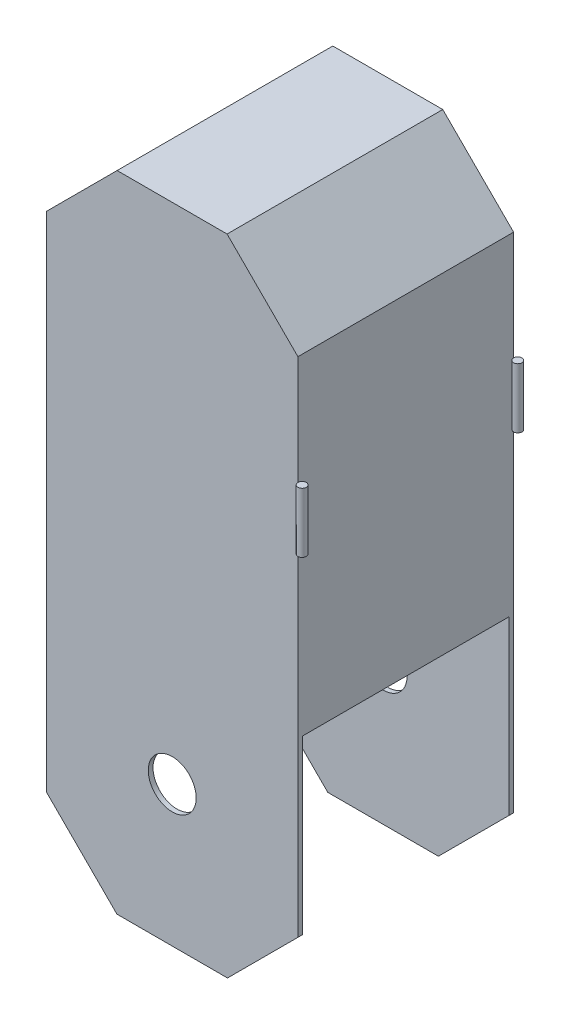
ISO-10303-21;
HEADER;
FILE_DESCRIPTION(('STEP AP214'),'2;1');
FILE_NAME('part.step','',(''),(''),'','','');
FILE_SCHEMA(('AUTOMOTIVE_DESIGN { 1 0 10303 214 1 1 1 1 }'));
ENDSEC;
DATA;
#1=APPLICATION_CONTEXT('core data for automotive mechanical design processes');
#2=APPLICATION_PROTOCOL_DEFINITION('international standard','automotive_design',2000,#1);
#3=PRODUCT_CONTEXT('',#1,'mechanical');
#4=PRODUCT('Part','Part','',(#3));
#5=PRODUCT_RELATED_PRODUCT_CATEGORY('part','',(#4));
#6=PRODUCT_DEFINITION_FORMATION('','',#4);
#7=PRODUCT_DEFINITION_CONTEXT('part definition',#1,'design');
#8=PRODUCT_DEFINITION('design','',#6,#7);
#9=PRODUCT_DEFINITION_SHAPE('','',#8);
#10=(LENGTH_UNIT() NAMED_UNIT(*) SI_UNIT(.MILLI.,.METRE.));
#11=(NAMED_UNIT(*) PLANE_ANGLE_UNIT() SI_UNIT($,.RADIAN.));
#12=(NAMED_UNIT(*) SI_UNIT($,.STERADIAN.) SOLID_ANGLE_UNIT());
#13=UNCERTAINTY_MEASURE_WITH_UNIT(LENGTH_MEASURE(1.E-05),#10,'distance_accuracy_value','');
#14=(GEOMETRIC_REPRESENTATION_CONTEXT(3) GLOBAL_UNCERTAINTY_ASSIGNED_CONTEXT((#13)) GLOBAL_UNIT_ASSIGNED_CONTEXT((#10,
#11,#12)) REPRESENTATION_CONTEXT('',''));
#15=CARTESIAN_POINT('',(0.,0.,0.));
#16=DIRECTION('',(0.,0.,1.));
#17=DIRECTION('',(1.,0.,0.));
#18=AXIS2_PLACEMENT_3D('',#15,#16,#17);
#19=CARTESIAN_POINT('',(108.582921558728,490.825947063665,180.));
#20=DIRECTION('',(0.,-1.,0.));
#21=DIRECTION('',(1.,0.,0.));
#22=AXIS2_PLACEMENT_3D('',#19,#20,#21);
#23=CYLINDRICAL_SURFACE('',#22,3.50000000000001);
#24=CARTESIAN_POINT('',(108.582921558728,490.825947063665,180.));
#25=DIRECTION('',(0.,1.,0.));
#26=DIRECTION('',(1.,0.,0.));
#27=AXIS2_PLACEMENT_3D('',#24,#25,#26);
#28=CIRCLE('',#27,3.50000000000001);
#29=CARTESIAN_POINT('',(112.082921558728,490.825947063665,180.));
#30=VERTEX_POINT('',#29);
#31=EDGE_CURVE('E11',#30,#30,#28,.T.);
#32=ORIENTED_EDGE('',*,*,#31,.F.);
#33=EDGE_LOOP('',(#32));
#34=FACE_BOUND('',#33,.T.);
#35=CARTESIAN_POINT('',(108.582921558728,440.825947063665,180.));
#36=DIRECTION('',(0.,1.,0.));
#37=DIRECTION('',(1.,0.,0.));
#38=AXIS2_PLACEMENT_3D('',#35,#36,#37);
#39=CIRCLE('',#38,3.50000000000001);
#40=CARTESIAN_POINT('',(112.082921558728,440.825947063665,180.));
#41=VERTEX_POINT('',#40);
#42=EDGE_CURVE('E43',#41,#41,#39,.T.);
#43=ORIENTED_EDGE('',*,*,#42,.T.);
#44=EDGE_LOOP('',(#43));
#45=FACE_BOUND('',#44,.T.);
#46=ADVANCED_FACE('F40',(#34,#45),#23,.T.);
#47=CARTESIAN_POINT('',(108.582921558728,490.825947063665,180.));
#48=DIRECTION('',(0.,-1.,0.));
#49=DIRECTION('',(1.,0.,0.));
#50=AXIS2_PLACEMENT_3D('',#47,#48,#49);
#51=PLANE('',#50);
#52=ORIENTED_EDGE('',*,*,#31,.T.);
#53=EDGE_LOOP('',(#52));
#54=FACE_BOUND('',#53,.T.);
#55=ADVANCED_FACE('F55',(#54),#51,.F.);
#56=CARTESIAN_POINT('',(108.582921558728,440.825947063665,180.));
#57=DIRECTION('',(0.,-1.,0.));
#58=DIRECTION('',(1.,0.,0.));
#59=AXIS2_PLACEMENT_3D('',#56,#57,#58);
#60=PLANE('',#59);
#61=ORIENTED_EDGE('',*,*,#42,.F.);
#62=EDGE_LOOP('',(#61));
#63=FACE_BOUND('',#62,.T.);
#64=ADVANCED_FACE('F53',(#63),#60,.T.);
#65=CLOSED_SHELL('',(#46,#55,#64));
#66=MANIFOLD_SOLID_BREP('B2',#65);
#67=CARTESIAN_POINT('',(108.582921558728,490.825947063665,0.));
#68=DIRECTION('',(0.,-1.,0.));
#69=DIRECTION('',(1.,0.,0.));
#70=AXIS2_PLACEMENT_3D('',#67,#68,#69);
#71=CYLINDRICAL_SURFACE('',#70,3.50000000000001);
#72=CARTESIAN_POINT('',(108.582921558728,490.825947063665,0.));
#73=DIRECTION('',(0.,1.,0.));
#74=DIRECTION('',(-1.,0.,0.));
#75=AXIS2_PLACEMENT_3D('',#72,#73,#74);
#76=CIRCLE('',#75,3.50000000000001);
#77=CARTESIAN_POINT('',(105.082921558728,490.825947063665,0.));
#78=VERTEX_POINT('',#77);
#79=EDGE_CURVE('E39',#78,#78,#76,.T.);
#80=ORIENTED_EDGE('',*,*,#79,.F.);
#81=EDGE_LOOP('',(#80));
#82=FACE_BOUND('',#81,.T.);
#83=CARTESIAN_POINT('',(108.582921558728,440.825947063665,0.));
#84=DIRECTION('',(0.,1.,0.));
#85=DIRECTION('',(-1.,0.,0.));
#86=AXIS2_PLACEMENT_3D('',#83,#84,#85);
#87=CIRCLE('',#86,3.50000000000001);
#88=CARTESIAN_POINT('',(105.082921558728,440.825947063665,0.));
#89=VERTEX_POINT('',#88);
#90=EDGE_CURVE('E93',#89,#89,#87,.T.);
#91=ORIENTED_EDGE('',*,*,#90,.T.);
#92=EDGE_LOOP('',(#91));
#93=FACE_BOUND('',#92,.T.);
#94=ADVANCED_FACE('F90',(#82,#93),#71,.T.);
#95=CARTESIAN_POINT('',(108.582921558728,490.825947063665,0.));
#96=DIRECTION('',(0.,1.,0.));
#97=DIRECTION('',(-1.,0.,0.));
#98=AXIS2_PLACEMENT_3D('',#95,#96,#97);
#99=PLANE('',#98);
#100=ORIENTED_EDGE('',*,*,#79,.T.);
#101=EDGE_LOOP('',(#100));
#102=FACE_BOUND('',#101,.T.);
#103=ADVANCED_FACE('F105',(#102),#99,.T.);
#104=CARTESIAN_POINT('',(108.582921558728,440.825947063665,0.));
#105=DIRECTION('',(0.,1.,0.));
#106=DIRECTION('',(-1.,0.,0.));
#107=AXIS2_PLACEMENT_3D('',#104,#105,#106);
#108=PLANE('',#107);
#109=ORIENTED_EDGE('',*,*,#90,.F.);
#110=EDGE_LOOP('',(#109));
#111=FACE_BOUND('',#110,.T.);
#112=ADVANCED_FACE('F103',(#111),#108,.F.);
#113=CLOSED_SHELL('',(#94,#103,#112));
#114=MANIFOLD_SOLID_BREP('B6',#113);
#115=CARTESIAN_POINT('',(-104.917078441272,162.212880509357,180.));
#116=DIRECTION('',(0.707106781186547,0.707106781186547,0.));
#117=DIRECTION('',(-0.707106781186548,0.707106781186548,0.));
#118=AXIS2_PLACEMENT_3D('',#115,#116,#117);
#119=PLANE('',#118);
#120=DIRECTION('',(0.,0.,-1.));
#121=VECTOR('',#120,1.);
#122=CARTESIAN_POINT('',(-104.917078441272,162.212880509357,180.));
#123=LINE('',#122,#121);
#124=CARTESIAN_POINT('',(-104.917078441272,162.212880509357,180.));
#125=VERTEX_POINT('',#124);
#126=CARTESIAN_POINT('',(-104.917078441272,162.212880509357,176.));
#127=VERTEX_POINT('',#126);
#128=EDGE_CURVE('E267',#125,#127,#123,.T.);
#129=ORIENTED_EDGE('',*,*,#128,.T.);
#130=DIRECTION('',(0.707106781186548,-0.707106781186548,0.));
#131=VECTOR('',#130,1.);
#132=CARTESIAN_POINT('',(-104.917078441272,162.212880509357,176.));
#133=LINE('',#132,#131);
#134=CARTESIAN_POINT('',(-45.973174510304,103.268976578389,176.));
#135=VERTEX_POINT('',#134);
#136=EDGE_CURVE('E229',#127,#135,#133,.T.);
#137=ORIENTED_EDGE('',*,*,#136,.T.);
#138=DIRECTION('',(0.,0.,-1.));
#139=VECTOR('',#138,1.);
#140=CARTESIAN_POINT('',(-45.973174510304,103.268976578389,180.));
#141=LINE('',#140,#139);
#142=CARTESIAN_POINT('',(-45.973174510304,103.268976578389,180.));
#143=VERTEX_POINT('',#142);
#144=EDGE_CURVE('E227',#143,#135,#141,.T.);
#145=ORIENTED_EDGE('',*,*,#144,.F.);
#146=DIRECTION('',(0.707106781186547,-0.707106781186547,0.));
#147=VECTOR('',#146,1.);
#148=CARTESIAN_POINT('',(-104.917078441272,162.212880509357,180.));
#149=LINE('',#148,#147);
#150=EDGE_CURVE('E213',#125,#143,#149,.T.);
#151=ORIENTED_EDGE('',*,*,#150,.F.);
#152=EDGE_LOOP('',(#129,#137,#145,#151));
#153=FACE_BOUND('',#152,.T.);
#154=ADVANCED_FACE('F130',(#153),#119,.F.);
#155=CARTESIAN_POINT('',(-45.973174510304,103.268976578389,180.));
#156=DIRECTION('',(0.,1.,0.));
#157=DIRECTION('',(0.,0.,1.));
#158=AXIS2_PLACEMENT_3D('',#155,#156,#157);
#159=PLANE('',#158);
#160=ORIENTED_EDGE('',*,*,#144,.T.);
#161=DIRECTION('',(1.,0.,0.));
#162=VECTOR('',#161,1.);
#163=CARTESIAN_POINT('',(-45.973174510304,103.268976578389,176.));
#164=LINE('',#163,#162);
#165=CARTESIAN_POINT('',(46.326817336749,103.268976578389,176.));
#166=VERTEX_POINT('',#165);
#167=EDGE_CURVE('E322',#135,#166,#164,.T.);
#168=ORIENTED_EDGE('',*,*,#167,.T.);
#169=DIRECTION('',(0.,0.,-1.));
#170=VECTOR('',#169,1.);
#171=CARTESIAN_POINT('',(46.326817336749,103.268976578389,180.));
#172=LINE('',#171,#170);
#173=CARTESIAN_POINT('',(46.326817336749,103.268976578389,180.));
#174=VERTEX_POINT('',#173);
#175=EDGE_CURVE('E237',#174,#166,#172,.T.);
#176=ORIENTED_EDGE('',*,*,#175,.F.);
#177=DIRECTION('',(1.,0.,0.));
#178=VECTOR('',#177,1.);
#179=CARTESIAN_POINT('',(-45.973174510304,103.268976578389,180.));
#180=LINE('',#179,#178);
#181=EDGE_CURVE('E217',#143,#174,#180,.T.);
#182=ORIENTED_EDGE('',*,*,#181,.F.);
#183=EDGE_LOOP('',(#160,#168,#176,#182));
#184=FACE_BOUND('',#183,.T.);
#185=ADVANCED_FACE('F235',(#184),#159,.F.);
#186=CARTESIAN_POINT('',(46.326817336749,103.268976578389,180.));
#187=DIRECTION('',(-0.707106781186547,0.707106781186547,0.));
#188=DIRECTION('',(-0.707106781186548,-0.707106781186548,0.));
#189=AXIS2_PLACEMENT_3D('',#186,#187,#188);
#190=PLANE('',#189);
#191=ORIENTED_EDGE('',*,*,#175,.T.);
#192=DIRECTION('',(0.707106781186548,0.707106781186548,0.));
#193=VECTOR('',#192,1.);
#194=CARTESIAN_POINT('',(46.326817336749,103.268976578389,176.));
#195=LINE('',#194,#193);
#196=CARTESIAN_POINT('',(105.082921558728,162.025080800367,176.));
#197=VERTEX_POINT('',#196);
#198=EDGE_CURVE('E88',#166,#197,#195,.T.);
#199=ORIENTED_EDGE('',*,*,#198,.T.);
#200=DIRECTION('',(0.,0.,-1.));
#201=VECTOR('',#200,1.);
#202=CARTESIAN_POINT('',(105.082921558728,162.025080800368,180.));
#203=LINE('',#202,#201);
#204=CARTESIAN_POINT('',(105.082921558728,162.025080800368,180.));
#205=VERTEX_POINT('',#204);
#206=EDGE_CURVE('E262',#205,#197,#203,.T.);
#207=ORIENTED_EDGE('',*,*,#206,.F.);
#208=DIRECTION('',(0.707106781186547,0.707106781186548,0.));
#209=VECTOR('',#208,1.);
#210=CARTESIAN_POINT('',(46.326817336749,103.268976578389,180.));
#211=LINE('',#210,#209);
#212=EDGE_CURVE('E155',#174,#205,#211,.T.);
#213=ORIENTED_EDGE('',*,*,#212,.F.);
#214=EDGE_LOOP('',(#191,#199,#207,#213));
#215=FACE_BOUND('',#214,.T.);
#216=ADVANCED_FACE('F383',(#215),#190,.F.);
#217=CARTESIAN_POINT('',(105.082921558728,162.025080800368,180.));
#218=DIRECTION('',(-1.,0.,0.));
#219=DIRECTION('',(0.,-1.,0.));
#220=AXIS2_PLACEMENT_3D('',#217,#218,#219);
#221=PLANE('',#220);
#222=ORIENTED_EDGE('',*,*,#206,.T.);
#223=DIRECTION('',(0.,-1.,0.));
#224=VECTOR('',#223,1.);
#225=CARTESIAN_POINT('',(105.082921558728,96.7638285879703,176.));
#226=LINE('',#225,#224);
#227=CARTESIAN_POINT('',(105.082921558728,305.626166773163,176.));
#228=VERTEX_POINT('',#227);
#229=EDGE_CURVE('E341',#228,#197,#226,.T.);
#230=ORIENTED_EDGE('',*,*,#229,.F.);
#231=DIRECTION('',(0.,0.,1.));
#232=VECTOR('',#231,1.);
#233=CARTESIAN_POINT('',(105.082921558728,305.626166773163,176.));
#234=LINE('',#233,#232);
#235=CARTESIAN_POINT('',(105.082921558728,305.626166773163,4.));
#236=VERTEX_POINT('',#235);
#237=EDGE_CURVE('E335',#236,#228,#234,.T.);
#238=ORIENTED_EDGE('',*,*,#237,.F.);
#239=DIRECTION('',(0.,1.,0.));
#240=VECTOR('',#239,1.);
#241=CARTESIAN_POINT('',(105.082921558728,96.7638285879703,4.));
#242=LINE('',#241,#240);
#243=CARTESIAN_POINT('',(105.082921558728,162.025080800367,4.));
#244=VERTEX_POINT('',#243);
#245=EDGE_CURVE('E339',#244,#236,#242,.T.);
#246=ORIENTED_EDGE('',*,*,#245,.F.);
#247=CARTESIAN_POINT('',(105.082921558728,162.025080800368,0.));
#248=VERTEX_POINT('',#247);
#249=EDGE_CURVE('E189',#244,#248,#203,.T.);
#250=ORIENTED_EDGE('',*,*,#249,.T.);
#251=DIRECTION('',(0.,1.,0.));
#252=VECTOR('',#251,1.);
#253=CARTESIAN_POINT('',(105.082921558728,162.025080800368,0.));
#254=LINE('',#253,#252);
#255=CARTESIAN_POINT('',(105.082921558728,581.722068253563,0.));
#256=VERTEX_POINT('',#255);
#257=EDGE_CURVE('E242',#248,#256,#254,.T.);
#258=ORIENTED_EDGE('',*,*,#257,.T.);
#259=DIRECTION('',(0.,0.,-1.));
#260=VECTOR('',#259,1.);
#261=CARTESIAN_POINT('',(105.082921558728,581.722068253563,180.));
#262=LINE('',#261,#260);
#263=CARTESIAN_POINT('',(105.082921558728,581.722068253563,180.));
#264=VERTEX_POINT('',#263);
#265=EDGE_CURVE('E278',#264,#256,#262,.T.);
#266=ORIENTED_EDGE('',*,*,#265,.F.);
#267=DIRECTION('',(0.,1.,0.));
#268=VECTOR('',#267,1.);
#269=CARTESIAN_POINT('',(105.082921558728,162.025080800368,180.));
#270=LINE('',#269,#268);
#271=EDGE_CURVE('E261',#205,#264,#270,.T.);
#272=ORIENTED_EDGE('',*,*,#271,.F.);
#273=EDGE_LOOP('',(#222,#230,#238,#246,#250,#258,#266,#272));
#274=FACE_BOUND('',#273,.T.);
#275=ADVANCED_FACE('F132',(#274),#221,.F.);
#276=CARTESIAN_POINT('',(105.082921558728,581.722068253563,180.));
#277=DIRECTION('',(-0.707106781186548,-0.707106781186547,0.));
#278=DIRECTION('',(0.707106781186547,-0.707106781186548,0.));
#279=AXIS2_PLACEMENT_3D('',#276,#277,#278);
#280=PLANE('',#279);
#281=DIRECTION('',(-0.707106781186547,0.707106781186548,0.));
#282=VECTOR('',#281,1.);
#283=CARTESIAN_POINT('',(105.082921558728,581.722068253563,0.));
#284=LINE('',#283,#282);
#285=CARTESIAN_POINT('',(45.9790427486258,640.825947063665,0.));
#286=VERTEX_POINT('',#285);
#287=EDGE_CURVE('E244',#256,#286,#284,.T.);
#288=ORIENTED_EDGE('',*,*,#287,.T.);
#289=DIRECTION('',(0.,0.,-1.));
#290=VECTOR('',#289,1.);
#291=CARTESIAN_POINT('',(45.9790427486258,640.825947063665,180.));
#292=LINE('',#291,#290);
#293=CARTESIAN_POINT('',(45.9790427486258,640.825947063665,180.));
#294=VERTEX_POINT('',#293);
#295=EDGE_CURVE('E275',#294,#286,#292,.T.);
#296=ORIENTED_EDGE('',*,*,#295,.F.);
#297=DIRECTION('',(-0.707106781186547,0.707106781186548,0.));
#298=VECTOR('',#297,1.);
#299=CARTESIAN_POINT('',(105.082921558728,581.722068253563,180.));
#300=LINE('',#299,#298);
#301=EDGE_CURVE('E198',#264,#294,#300,.T.);
#302=ORIENTED_EDGE('',*,*,#301,.F.);
#303=ORIENTED_EDGE('',*,*,#265,.T.);
#304=EDGE_LOOP('',(#288,#296,#302,#303));
#305=FACE_BOUND('',#304,.T.);
#306=ADVANCED_FACE('F298',(#305),#280,.F.);
#307=CARTESIAN_POINT('',(45.9790427486258,640.825947063665,180.));
#308=DIRECTION('',(0.,-1.,0.));
#309=DIRECTION('',(1.,0.,0.));
#310=AXIS2_PLACEMENT_3D('',#307,#308,#309);
#311=PLANE('',#310);
#312=DIRECTION('',(-1.,0.,0.));
#313=VECTOR('',#312,1.);
#314=CARTESIAN_POINT('',(45.9790427486258,640.825947063665,0.));
#315=LINE('',#314,#313);
#316=CARTESIAN_POINT('',(-45.8131996311706,640.825947063664,0.));
#317=VERTEX_POINT('',#316);
#318=EDGE_CURVE('E246',#286,#317,#315,.T.);
#319=ORIENTED_EDGE('',*,*,#318,.T.);
#320=DIRECTION('',(0.,0.,-1.));
#321=VECTOR('',#320,1.);
#322=CARTESIAN_POINT('',(-45.8131996311706,640.825947063664,180.));
#323=LINE('',#322,#321);
#324=CARTESIAN_POINT('',(-45.8131996311706,640.825947063664,180.));
#325=VERTEX_POINT('',#324);
#326=EDGE_CURVE('E272',#325,#317,#323,.T.);
#327=ORIENTED_EDGE('',*,*,#326,.F.);
#328=DIRECTION('',(-1.,0.,0.));
#329=VECTOR('',#328,1.);
#330=CARTESIAN_POINT('',(45.9790427486258,640.825947063665,180.));
#331=LINE('',#330,#329);
#332=EDGE_CURVE('E303',#294,#325,#331,.T.);
#333=ORIENTED_EDGE('',*,*,#332,.F.);
#334=ORIENTED_EDGE('',*,*,#295,.T.);
#335=EDGE_LOOP('',(#319,#327,#333,#334));
#336=FACE_BOUND('',#335,.T.);
#337=ADVANCED_FACE('F301',(#336),#311,.F.);
#338=CARTESIAN_POINT('',(-45.8131996311706,640.825947063664,180.));
#339=DIRECTION('',(0.707106781186548,-0.707106781186547,0.));
#340=DIRECTION('',(0.707106781186547,0.707106781186548,0.));
#341=AXIS2_PLACEMENT_3D('',#338,#339,#340);
#342=PLANE('',#341);
#343=DIRECTION('',(-0.707106781186547,-0.707106781186548,0.));
#344=VECTOR('',#343,1.);
#345=CARTESIAN_POINT('',(-45.8131996311706,640.825947063664,0.));
#346=LINE('',#345,#344);
#347=CARTESIAN_POINT('',(-104.917078441272,581.722068253563,0.));
#348=VERTEX_POINT('',#347);
#349=EDGE_CURVE('E248',#317,#348,#346,.T.);
#350=ORIENTED_EDGE('',*,*,#349,.T.);
#351=DIRECTION('',(0.,0.,-1.));
#352=VECTOR('',#351,1.);
#353=CARTESIAN_POINT('',(-104.917078441272,581.722068253563,180.));
#354=LINE('',#353,#352);
#355=CARTESIAN_POINT('',(-104.917078441272,581.722068253563,180.));
#356=VERTEX_POINT('',#355);
#357=EDGE_CURVE('E269',#356,#348,#354,.T.);
#358=ORIENTED_EDGE('',*,*,#357,.F.);
#359=DIRECTION('',(-0.707106781186547,-0.707106781186548,0.));
#360=VECTOR('',#359,1.);
#361=CARTESIAN_POINT('',(-45.8131996311706,640.825947063664,180.));
#362=LINE('',#361,#360);
#363=EDGE_CURVE('E315',#325,#356,#362,.T.);
#364=ORIENTED_EDGE('',*,*,#363,.F.);
#365=ORIENTED_EDGE('',*,*,#326,.T.);
#366=EDGE_LOOP('',(#350,#358,#364,#365));
#367=FACE_BOUND('',#366,.T.);
#368=ADVANCED_FACE('F308',(#367),#342,.F.);
#369=CARTESIAN_POINT('',(-104.917078441272,581.722068253563,180.));
#370=DIRECTION('',(1.,0.,0.));
#371=DIRECTION('',(0.,1.,0.));
#372=AXIS2_PLACEMENT_3D('',#369,#370,#371);
#373=PLANE('',#372);
#374=DIRECTION('',(0.,0.,1.));
#375=VECTOR('',#374,1.);
#376=CARTESIAN_POINT('',(-104.917078441272,305.626166773163,176.));
#377=LINE('',#376,#375);
#378=CARTESIAN_POINT('',(-104.917078441272,305.626166773163,4.));
#379=VERTEX_POINT('',#378);
#380=CARTESIAN_POINT('',(-104.917078441272,305.626166773163,176.));
#381=VERTEX_POINT('',#380);
#382=EDGE_CURVE('E332',#379,#381,#377,.T.);
#383=ORIENTED_EDGE('',*,*,#382,.T.);
#384=DIRECTION('',(0.,-1.,0.));
#385=VECTOR('',#384,1.);
#386=CARTESIAN_POINT('',(-104.917078441272,96.7638285879702,176.));
#387=LINE('',#386,#385);
#388=EDGE_CURVE('E338',#381,#127,#387,.T.);
#389=ORIENTED_EDGE('',*,*,#388,.T.);
#390=ORIENTED_EDGE('',*,*,#128,.F.);
#391=DIRECTION('',(0.,-1.,0.));
#392=VECTOR('',#391,1.);
#393=CARTESIAN_POINT('',(-104.917078441272,581.722068253563,180.));
#394=LINE('',#393,#392);
#395=EDGE_CURVE('E220',#356,#125,#394,.T.);
#396=ORIENTED_EDGE('',*,*,#395,.F.);
#397=ORIENTED_EDGE('',*,*,#357,.T.);
#398=DIRECTION('',(0.,-1.,0.));
#399=VECTOR('',#398,1.);
#400=CARTESIAN_POINT('',(-104.917078441272,581.722068253563,0.));
#401=LINE('',#400,#399);
#402=CARTESIAN_POINT('',(-104.917078441272,162.212880509357,0.));
#403=VERTEX_POINT('',#402);
#404=EDGE_CURVE('E250',#348,#403,#401,.T.);
#405=ORIENTED_EDGE('',*,*,#404,.T.);
#406=CARTESIAN_POINT('',(-104.917078441272,162.212880509357,4.));
#407=VERTEX_POINT('',#406);
#408=EDGE_CURVE('E232',#407,#403,#123,.T.);
#409=ORIENTED_EDGE('',*,*,#408,.F.);
#410=DIRECTION('',(0.,1.,0.));
#411=VECTOR('',#410,1.);
#412=CARTESIAN_POINT('',(-104.917078441272,96.7638285879702,4.));
#413=LINE('',#412,#411);
#414=EDGE_CURVE('E346',#407,#379,#413,.T.);
#415=ORIENTED_EDGE('',*,*,#414,.T.);
#416=EDGE_LOOP('',(#383,#389,#390,#396,#397,#405,#409,#415));
#417=FACE_BOUND('',#416,.T.);
#418=ADVANCED_FACE('F312',(#417),#373,.F.);
#419=CARTESIAN_POINT('',(-45.973174510304,103.268976578389,4.));
#420=VERTEX_POINT('',#419);
#421=CARTESIAN_POINT('',(-45.973174510304,103.268976578389,0.));
#422=VERTEX_POINT('',#421);
#423=EDGE_CURVE('E233',#420,#422,#141,.T.);
#424=ORIENTED_EDGE('',*,*,#423,.F.);
#425=DIRECTION('',(-0.707106781186548,0.707106781186548,0.));
#426=VECTOR('',#425,1.);
#427=CARTESIAN_POINT('',(-104.917078441272,162.212880509357,4.));
#428=LINE('',#427,#426);
#429=EDGE_CURVE('E324',#420,#407,#428,.T.);
#430=ORIENTED_EDGE('',*,*,#429,.T.);
#431=ORIENTED_EDGE('',*,*,#408,.T.);
#432=DIRECTION('',(0.707106781186547,-0.707106781186547,0.));
#433=VECTOR('',#432,1.);
#434=CARTESIAN_POINT('',(-104.917078441272,162.212880509357,0.));
#435=LINE('',#434,#433);
#436=EDGE_CURVE('E253',#403,#422,#435,.T.);
#437=ORIENTED_EDGE('',*,*,#436,.T.);
#438=EDGE_LOOP('',(#424,#430,#431,#437));
#439=FACE_BOUND('',#438,.T.);
#440=ADVANCED_FACE('F379',(#439),#119,.F.);
#441=CARTESIAN_POINT('',(46.326817336749,103.268976578389,4.00000000000006));
#442=VERTEX_POINT('',#441);
#443=CARTESIAN_POINT('',(46.326817336749,103.268976578389,0.));
#444=VERTEX_POINT('',#443);
#445=EDGE_CURVE('E265',#442,#444,#172,.T.);
#446=ORIENTED_EDGE('',*,*,#445,.F.);
#447=DIRECTION('',(-1.,0.,0.));
#448=VECTOR('',#447,1.);
#449=CARTESIAN_POINT('',(-45.973174510304,103.268976578389,4.));
#450=LINE('',#449,#448);
#451=EDGE_CURVE('E146',#442,#420,#450,.T.);
#452=ORIENTED_EDGE('',*,*,#451,.T.);
#453=ORIENTED_EDGE('',*,*,#423,.T.);
#454=DIRECTION('',(1.,0.,0.));
#455=VECTOR('',#454,1.);
#456=CARTESIAN_POINT('',(-45.973174510304,103.268976578389,0.));
#457=LINE('',#456,#455);
#458=EDGE_CURVE('E256',#422,#444,#457,.T.);
#459=ORIENTED_EDGE('',*,*,#458,.T.);
#460=EDGE_LOOP('',(#446,#452,#453,#459));
#461=FACE_BOUND('',#460,.T.);
#462=ADVANCED_FACE('F286',(#461),#159,.F.);
#463=ORIENTED_EDGE('',*,*,#249,.F.);
#464=DIRECTION('',(-0.707106781186548,-0.707106781186548,0.));
#465=VECTOR('',#464,1.);
#466=CARTESIAN_POINT('',(46.326817336749,103.268976578389,4.));
#467=LINE('',#466,#465);
#468=EDGE_CURVE('E139',#244,#442,#467,.T.);
#469=ORIENTED_EDGE('',*,*,#468,.T.);
#470=ORIENTED_EDGE('',*,*,#445,.T.);
#471=DIRECTION('',(0.707106781186547,0.707106781186548,0.));
#472=VECTOR('',#471,1.);
#473=CARTESIAN_POINT('',(46.326817336749,103.268976578389,0.));
#474=LINE('',#473,#472);
#475=EDGE_CURVE('E259',#444,#248,#474,.T.);
#476=ORIENTED_EDGE('',*,*,#475,.T.);
#477=EDGE_LOOP('',(#463,#469,#470,#476));
#478=FACE_BOUND('',#477,.T.);
#479=ADVANCED_FACE('F282',(#478),#190,.F.);
#480=CARTESIAN_POINT('',(105.082921558728,640.825947063665,180.));
#481=DIRECTION('',(0.,0.,1.));
#482=DIRECTION('',(1.,0.,0.));
#483=AXIS2_PLACEMENT_3D('',#480,#481,#482);
#484=PLANE('',#483);
#485=CARTESIAN_POINT('',(0.176821413222499,220.268976578389,180.));
#486=DIRECTION('',(0.,0.,-1.));
#487=DIRECTION('',(-1.,0.,0.));
#488=AXIS2_PLACEMENT_3D('',#485,#486,#487);
#489=CIRCLE('',#488,20.);
#490=CARTESIAN_POINT('',(-19.8231785867775,220.268976578389,180.));
#491=VERTEX_POINT('',#490);
#492=EDGE_CURVE('E355',#491,#491,#489,.T.);
#493=ORIENTED_EDGE('',*,*,#492,.T.);
#494=EDGE_LOOP('',(#493));
#495=FACE_BOUND('',#494,.T.);
#496=ORIENTED_EDGE('',*,*,#271,.T.);
#497=ORIENTED_EDGE('',*,*,#301,.T.);
#498=ORIENTED_EDGE('',*,*,#332,.T.);
#499=ORIENTED_EDGE('',*,*,#363,.T.);
#500=ORIENTED_EDGE('',*,*,#395,.T.);
#501=ORIENTED_EDGE('',*,*,#150,.T.);
#502=ORIENTED_EDGE('',*,*,#181,.T.);
#503=ORIENTED_EDGE('',*,*,#212,.T.);
#504=EDGE_LOOP('',(#496,#497,#498,#499,#500,#501,#502,#503));
#505=FACE_BOUND('',#504,.T.);
#506=ADVANCED_FACE('F215',(#495,#505),#484,.T.);
#507=CARTESIAN_POINT('',(105.082921558728,640.825947063665,0.));
#508=DIRECTION('',(0.,0.,1.));
#509=DIRECTION('',(1.,0.,0.));
#510=AXIS2_PLACEMENT_3D('',#507,#508,#509);
#511=PLANE('',#510);
#512=CARTESIAN_POINT('',(0.176821413222499,220.268976578389,0.));
#513=DIRECTION('',(0.,0.,-1.));
#514=DIRECTION('',(-1.,0.,0.));
#515=AXIS2_PLACEMENT_3D('',#512,#513,#514);
#516=CIRCLE('',#515,20.);
#517=CARTESIAN_POINT('',(-19.8231785867775,220.268976578389,0.));
#518=VERTEX_POINT('',#517);
#519=EDGE_CURVE('E352',#518,#518,#516,.T.);
#520=ORIENTED_EDGE('',*,*,#519,.F.);
#521=EDGE_LOOP('',(#520));
#522=FACE_BOUND('',#521,.T.);
#523=ORIENTED_EDGE('',*,*,#257,.F.);
#524=ORIENTED_EDGE('',*,*,#475,.F.);
#525=ORIENTED_EDGE('',*,*,#458,.F.);
#526=ORIENTED_EDGE('',*,*,#436,.F.);
#527=ORIENTED_EDGE('',*,*,#404,.F.);
#528=ORIENTED_EDGE('',*,*,#349,.F.);
#529=ORIENTED_EDGE('',*,*,#318,.F.);
#530=ORIENTED_EDGE('',*,*,#287,.F.);
#531=EDGE_LOOP('',(#523,#524,#525,#526,#527,#528,#529,#530));
#532=FACE_BOUND('',#531,.T.);
#533=ADVANCED_FACE('F294',(#522,#532),#511,.F.);
#534=CARTESIAN_POINT('',(-104.917078441272,96.7638285879702,176.));
#535=DIRECTION('',(0.,0.,1.));
#536=DIRECTION('',(1.,0.,0.));
#537=AXIS2_PLACEMENT_3D('',#534,#535,#536);
#538=PLANE('',#537);
#539=CARTESIAN_POINT('',(0.176821413222499,220.268976578389,176.));
#540=DIRECTION('',(0.,0.,1.));
#541=DIRECTION('',(1.,0.,0.));
#542=AXIS2_PLACEMENT_3D('',#539,#540,#541);
#543=CIRCLE('',#542,20.);
#544=CARTESIAN_POINT('',(-19.8231785867775,220.268976578389,176.));
#545=VERTEX_POINT('',#544);
#546=EDGE_CURVE('E344',#545,#545,#543,.T.);
#547=ORIENTED_EDGE('',*,*,#546,.T.);
#548=EDGE_LOOP('',(#547));
#549=FACE_BOUND('',#548,.T.);
#550=ORIENTED_EDGE('',*,*,#388,.F.);
#551=DIRECTION('',(1.,0.,0.));
#552=VECTOR('',#551,1.);
#553=CARTESIAN_POINT('',(-104.917078441272,305.626166773163,176.));
#554=LINE('',#553,#552);
#555=EDGE_CURVE('E328',#381,#228,#554,.T.);
#556=ORIENTED_EDGE('',*,*,#555,.T.);
#557=ORIENTED_EDGE('',*,*,#229,.T.);
#558=ORIENTED_EDGE('',*,*,#198,.F.);
#559=ORIENTED_EDGE('',*,*,#167,.F.);
#560=ORIENTED_EDGE('',*,*,#136,.F.);
#561=EDGE_LOOP('',(#550,#556,#557,#558,#559,#560));
#562=FACE_BOUND('',#561,.T.);
#563=ADVANCED_FACE('F404',(#549,#562),#538,.F.);
#564=CARTESIAN_POINT('',(-104.917078441272,96.7638285879702,4.));
#565=DIRECTION('',(0.,0.,-1.));
#566=DIRECTION('',(-1.,0.,0.));
#567=AXIS2_PLACEMENT_3D('',#564,#565,#566);
#568=PLANE('',#567);
#569=CARTESIAN_POINT('',(0.176821413222499,220.268976578389,4.));
#570=DIRECTION('',(0.,0.,-1.));
#571=DIRECTION('',(-1.,0.,0.));
#572=AXIS2_PLACEMENT_3D('',#569,#570,#571);
#573=CIRCLE('',#572,20.);
#574=CARTESIAN_POINT('',(-19.8231785867775,220.268976578389,4.00000000000003));
#575=VERTEX_POINT('',#574);
#576=EDGE_CURVE('E134',#575,#575,#573,.T.);
#577=ORIENTED_EDGE('',*,*,#576,.T.);
#578=EDGE_LOOP('',(#577));
#579=FACE_BOUND('',#578,.T.);
#580=ORIENTED_EDGE('',*,*,#451,.F.);
#581=ORIENTED_EDGE('',*,*,#468,.F.);
#582=ORIENTED_EDGE('',*,*,#245,.T.);
#583=DIRECTION('',(1.,0.,0.));
#584=VECTOR('',#583,1.);
#585=CARTESIAN_POINT('',(-104.917078441272,305.626166773163,4.));
#586=LINE('',#585,#584);
#587=EDGE_CURVE('E329',#379,#236,#586,.T.);
#588=ORIENTED_EDGE('',*,*,#587,.F.);
#589=ORIENTED_EDGE('',*,*,#414,.F.);
#590=ORIENTED_EDGE('',*,*,#429,.F.);
#591=EDGE_LOOP('',(#580,#581,#582,#588,#589,#590));
#592=FACE_BOUND('',#591,.T.);
#593=ADVANCED_FACE('F362',(#579,#592),#568,.F.);
#594=CARTESIAN_POINT('',(-104.917078441272,305.626166773163,176.));
#595=DIRECTION('',(0.,1.,0.));
#596=DIRECTION('',(-1.,0.,0.));
#597=AXIS2_PLACEMENT_3D('',#594,#595,#596);
#598=PLANE('',#597);
#599=ORIENTED_EDGE('',*,*,#237,.T.);
#600=ORIENTED_EDGE('',*,*,#555,.F.);
#601=ORIENTED_EDGE('',*,*,#382,.F.);
#602=ORIENTED_EDGE('',*,*,#587,.T.);
#603=EDGE_LOOP('',(#599,#600,#601,#602));
#604=FACE_BOUND('',#603,.T.);
#605=ADVANCED_FACE('F367',(#604),#598,.F.);
#606=CARTESIAN_POINT('',(0.176821413222499,220.268976578389,180.));
#607=DIRECTION('',(0.,0.,-1.));
#608=DIRECTION('',(-1.,0.,0.));
#609=AXIS2_PLACEMENT_3D('',#606,#607,#608);
#610=CYLINDRICAL_SURFACE('',#609,20.);
#611=CARTESIAN_POINT('',(-19.8231785867775,220.268976578389,0.));
#612=CARTESIAN_POINT('',(-19.8231785867775,220.268976578389,0.0416666666666898));
#613=CARTESIAN_POINT('',(-19.8231785867775,220.268976578389,0.0833333333333519));
#614=CARTESIAN_POINT('',(-19.8231785867775,220.268976578389,0.166666666666685));
#615=CARTESIAN_POINT('',(-19.8231785867775,220.268976578389,0.208333333333357));
#616=CARTESIAN_POINT('',(-19.8231785867775,220.268976578389,0.291666666666699));
#617=CARTESIAN_POINT('',(-19.8231785867775,220.268976578389,0.333333333333371));
#618=CARTESIAN_POINT('',(-19.8231785867775,220.268976578389,0.416666666666704));
#619=CARTESIAN_POINT('',(-19.8231785867775,220.268976578389,0.458333333333366));
#620=CARTESIAN_POINT('',(-19.8231785867775,220.268976578389,0.54166666666669));
#621=CARTESIAN_POINT('',(-19.8231785867775,220.268976578389,0.583333333333352));
#622=CARTESIAN_POINT('',(-19.8231785867775,220.268976578389,0.666666666666686));
#623=CARTESIAN_POINT('',(-19.8231785867775,220.268976578389,0.708333333333357));
#624=CARTESIAN_POINT('',(-19.8231785867775,220.268976578389,0.7916666666667));
#625=CARTESIAN_POINT('',(-19.8231785867775,220.268976578389,0.833333333333371));
#626=CARTESIAN_POINT('',(-19.8231785867775,220.268976578389,0.916666666666704));
#627=CARTESIAN_POINT('',(-19.8231785867775,220.268976578389,0.958333333333367));
#628=CARTESIAN_POINT('',(-19.8231785867775,220.268976578389,1.04166666666669));
#629=CARTESIAN_POINT('',(-19.8231785867775,220.268976578389,1.08333333333335));
#630=CARTESIAN_POINT('',(-19.8231785867775,220.268976578389,1.16666666666669));
#631=CARTESIAN_POINT('',(-19.8231785867775,220.268976578389,1.20833333333336));
#632=CARTESIAN_POINT('',(-19.8231785867775,220.268976578389,1.2916666666667));
#633=CARTESIAN_POINT('',(-19.8231785867775,220.268976578389,1.33333333333337));
#634=CARTESIAN_POINT('',(-19.8231785867775,220.268976578389,1.4166666666667));
#635=CARTESIAN_POINT('',(-19.8231785867775,220.268976578389,1.45833333333337));
#636=CARTESIAN_POINT('',(-19.8231785867775,220.268976578389,1.54166666666669));
#637=CARTESIAN_POINT('',(-19.8231785867775,220.268976578389,1.58333333333335));
#638=CARTESIAN_POINT('',(-19.8231785867775,220.268976578389,1.66666666666669));
#639=CARTESIAN_POINT('',(-19.8231785867775,220.268976578389,1.70833333333336));
#640=CARTESIAN_POINT('',(-19.8231785867775,220.268976578389,1.7916666666667));
#641=CARTESIAN_POINT('',(-19.8231785867775,220.268976578389,1.83333333333337));
#642=CARTESIAN_POINT('',(-19.8231785867775,220.268976578389,1.91666666666671));
#643=CARTESIAN_POINT('',(-19.8231785867775,220.268976578389,1.95833333333337));
#644=CARTESIAN_POINT('',(-19.8231785867775,220.268976578389,2.04166666666669));
#645=CARTESIAN_POINT('',(-19.8231785867775,220.268976578389,2.08333333333335));
#646=CARTESIAN_POINT('',(-19.8231785867775,220.268976578389,2.16666666666669));
#647=CARTESIAN_POINT('',(-19.8231785867775,220.268976578389,2.20833333333336));
#648=CARTESIAN_POINT('',(-19.8231785867775,220.268976578389,2.2916666666667));
#649=CARTESIAN_POINT('',(-19.8231785867775,220.268976578389,2.33333333333337));
#650=CARTESIAN_POINT('',(-19.8231785867775,220.268976578389,2.41666666666671));
#651=CARTESIAN_POINT('',(-19.8231785867775,220.268976578389,2.45833333333337));
#652=CARTESIAN_POINT('',(-19.8231785867775,220.268976578389,2.54166666666669));
#653=CARTESIAN_POINT('',(-19.8231785867775,220.268976578389,2.58333333333335));
#654=CARTESIAN_POINT('',(-19.8231785867775,220.268976578389,2.66666666666669));
#655=CARTESIAN_POINT('',(-19.8231785867775,220.268976578389,2.70833333333336));
#656=CARTESIAN_POINT('',(-19.8231785867775,220.268976578389,2.7916666666667));
#657=CARTESIAN_POINT('',(-19.8231785867775,220.268976578389,2.83333333333337));
#658=CARTESIAN_POINT('',(-19.8231785867775,220.268976578389,2.91666666666671));
#659=CARTESIAN_POINT('',(-19.8231785867775,220.268976578389,2.95833333333337));
#660=CARTESIAN_POINT('',(-19.8231785867775,220.268976578389,3.04166666666669));
#661=CARTESIAN_POINT('',(-19.8231785867775,220.268976578389,3.08333333333335));
#662=CARTESIAN_POINT('',(-19.8231785867775,220.268976578389,3.16666666666669));
#663=CARTESIAN_POINT('',(-19.8231785867775,220.268976578389,3.20833333333336));
#664=CARTESIAN_POINT('',(-19.8231785867775,220.268976578389,3.2916666666667));
#665=CARTESIAN_POINT('',(-19.8231785867775,220.268976578389,3.33333333333337));
#666=CARTESIAN_POINT('',(-19.8231785867775,220.268976578389,3.41666666666671));
#667=CARTESIAN_POINT('',(-19.8231785867775,220.268976578389,3.45833333333337));
#668=CARTESIAN_POINT('',(-19.8231785867775,220.268976578389,3.54166666666669));
#669=CARTESIAN_POINT('',(-19.8231785867775,220.268976578389,3.58333333333336));
#670=CARTESIAN_POINT('',(-19.8231785867775,220.268976578389,3.66666666666669));
#671=CARTESIAN_POINT('',(-19.8231785867775,220.268976578389,3.70833333333336));
#672=CARTESIAN_POINT('',(-19.8231785867775,220.268976578389,3.7916666666667));
#673=CARTESIAN_POINT('',(-19.8231785867775,220.268976578389,3.83333333333337));
#674=CARTESIAN_POINT('',(-19.8231785867775,220.268976578389,3.91666666666671));
#675=CARTESIAN_POINT('',(-19.8231785867775,220.268976578389,3.95833333333337));
#676=CARTESIAN_POINT('',(-19.8231785867775,220.268976578389,4.00000000000003));
#677=B_SPLINE_CURVE_WITH_KNOTS('',3,(#611,#612,#613,#614,#615,#616,#617,#618,#619,#620,#621,
#622,#623,#624,#625,#626,#627,#628,#629,#630,#631,#632,#633,#634,#635,#636,#637,#638,#639,#640,
#641,#642,#643,#644,#645,#646,#647,#648,#649,#650,#651,#652,#653,#654,#655,#656,#657,#658,#659,
#660,#661,#662,#663,#664,#665,#666,#667,#668,#669,#670,#671,#672,#673,#674,#675,#676),
.UNSPECIFIED.,.F.,.F.,(4,2,2,2,2,2,2,2,2,2,2,2,2,2,2,2,2,2,2,2,2,2,2,2,2,2,2,2,2,2,2,2,4),(0.,
0.124999999999986,0.25,0.375000000000014,0.5,0.624999999999987,0.750000000000001,
0.875000000000015,1.,1.12499999999999,1.25,1.37500000000002,1.5,1.62499999999999,1.75,
1.87500000000002,2.,2.12499999999999,2.25,2.37500000000002,2.5,2.62499999999999,2.75,
2.87500000000002,3.,3.12499999999999,3.25,3.37500000000002,3.5,3.62499999999999,3.75,
3.87500000000002,4.),.UNSPECIFIED.);
#678=EDGE_CURVE('BSEAM364',#518,#575,#677,.T.);
#679=ORIENTED_EDGE('',*,*,#519,.T.);
#680=ORIENTED_EDGE('',*,*,#576,.F.);
#681=ORIENTED_EDGE('',*,*,#678,.T.);
#682=ORIENTED_EDGE('',*,*,#678,.F.);
#683=EDGE_LOOP('',(#679,#681,#680,#682));
#684=FACE_BOUND('',#683,.T.);
#685=ADVANCED_FACE('F364',(#684),#610,.F.);
#686=CARTESIAN_POINT('',(-19.8231785867775,220.268976578389,180.));
#687=CARTESIAN_POINT('',(-19.8231785867775,220.268976578389,179.958333333333));
#688=CARTESIAN_POINT('',(-19.8231785867775,220.268976578389,179.916666666667));
#689=CARTESIAN_POINT('',(-19.8231785867775,220.268976578389,179.833333333333));
#690=CARTESIAN_POINT('',(-19.8231785867775,220.268976578389,179.791666666667));
#691=CARTESIAN_POINT('',(-19.8231785867775,220.268976578389,179.708333333333));
#692=CARTESIAN_POINT('',(-19.8231785867775,220.268976578389,179.666666666667));
#693=CARTESIAN_POINT('',(-19.8231785867775,220.268976578389,179.583333333333));
#694=CARTESIAN_POINT('',(-19.8231785867775,220.268976578389,179.541666666667));
#695=CARTESIAN_POINT('',(-19.8231785867775,220.268976578389,179.458333333333));
#696=CARTESIAN_POINT('',(-19.8231785867775,220.268976578389,179.416666666667));
#697=CARTESIAN_POINT('',(-19.8231785867775,220.268976578389,179.333333333333));
#698=CARTESIAN_POINT('',(-19.8231785867775,220.268976578389,179.291666666667));
#699=CARTESIAN_POINT('',(-19.8231785867775,220.268976578389,179.208333333333));
#700=CARTESIAN_POINT('',(-19.8231785867775,220.268976578389,179.166666666667));
#701=CARTESIAN_POINT('',(-19.8231785867775,220.268976578389,179.083333333333));
#702=CARTESIAN_POINT('',(-19.8231785867775,220.268976578389,179.041666666667));
#703=CARTESIAN_POINT('',(-19.8231785867775,220.268976578389,178.958333333333));
#704=CARTESIAN_POINT('',(-19.8231785867775,220.268976578389,178.916666666667));
#705=CARTESIAN_POINT('',(-19.8231785867775,220.268976578389,178.833333333333));
#706=CARTESIAN_POINT('',(-19.8231785867775,220.268976578389,178.791666666667));
#707=CARTESIAN_POINT('',(-19.8231785867775,220.268976578389,178.708333333333));
#708=CARTESIAN_POINT('',(-19.8231785867775,220.268976578389,178.666666666667));
#709=CARTESIAN_POINT('',(-19.8231785867775,220.268976578389,178.583333333333));
#710=CARTESIAN_POINT('',(-19.8231785867775,220.268976578389,178.541666666667));
#711=CARTESIAN_POINT('',(-19.8231785867775,220.268976578389,178.458333333333));
#712=CARTESIAN_POINT('',(-19.8231785867775,220.268976578389,178.416666666667));
#713=CARTESIAN_POINT('',(-19.8231785867775,220.268976578389,178.333333333333));
#714=CARTESIAN_POINT('',(-19.8231785867775,220.268976578389,178.291666666667));
#715=CARTESIAN_POINT('',(-19.8231785867775,220.268976578389,178.208333333333));
#716=CARTESIAN_POINT('',(-19.8231785867775,220.268976578389,178.166666666667));
#717=CARTESIAN_POINT('',(-19.8231785867775,220.268976578389,178.083333333333));
#718=CARTESIAN_POINT('',(-19.8231785867775,220.268976578389,178.041666666667));
#719=CARTESIAN_POINT('',(-19.8231785867775,220.268976578389,177.958333333333));
#720=CARTESIAN_POINT('',(-19.8231785867775,220.268976578389,177.916666666667));
#721=CARTESIAN_POINT('',(-19.8231785867775,220.268976578389,177.833333333333));
#722=CARTESIAN_POINT('',(-19.8231785867775,220.268976578389,177.791666666667));
#723=CARTESIAN_POINT('',(-19.8231785867775,220.268976578389,177.708333333333));
#724=CARTESIAN_POINT('',(-19.8231785867775,220.268976578389,177.666666666667));
#725=CARTESIAN_POINT('',(-19.8231785867775,220.268976578389,177.583333333333));
#726=CARTESIAN_POINT('',(-19.8231785867775,220.268976578389,177.541666666667));
#727=CARTESIAN_POINT('',(-19.8231785867775,220.268976578389,177.458333333333));
#728=CARTESIAN_POINT('',(-19.8231785867775,220.268976578389,177.416666666667));
#729=CARTESIAN_POINT('',(-19.8231785867775,220.268976578389,177.333333333333));
#730=CARTESIAN_POINT('',(-19.8231785867775,220.268976578389,177.291666666667));
#731=CARTESIAN_POINT('',(-19.8231785867775,220.268976578389,177.208333333333));
#732=CARTESIAN_POINT('',(-19.8231785867775,220.268976578389,177.166666666667));
#733=CARTESIAN_POINT('',(-19.8231785867775,220.268976578389,177.083333333333));
#734=CARTESIAN_POINT('',(-19.8231785867775,220.268976578389,177.041666666667));
#735=CARTESIAN_POINT('',(-19.8231785867775,220.268976578389,176.958333333333));
#736=CARTESIAN_POINT('',(-19.8231785867775,220.268976578389,176.916666666667));
#737=CARTESIAN_POINT('',(-19.8231785867775,220.268976578389,176.833333333333));
#738=CARTESIAN_POINT('',(-19.8231785867775,220.268976578389,176.791666666667));
#739=CARTESIAN_POINT('',(-19.8231785867775,220.268976578389,176.708333333333));
#740=CARTESIAN_POINT('',(-19.8231785867775,220.268976578389,176.666666666667));
#741=CARTESIAN_POINT('',(-19.8231785867775,220.268976578389,176.583333333333));
#742=CARTESIAN_POINT('',(-19.8231785867775,220.268976578389,176.541666666667));
#743=CARTESIAN_POINT('',(-19.8231785867775,220.268976578389,176.458333333333));
#744=CARTESIAN_POINT('',(-19.8231785867775,220.268976578389,176.416666666667));
#745=CARTESIAN_POINT('',(-19.8231785867775,220.268976578389,176.333333333333));
#746=CARTESIAN_POINT('',(-19.8231785867775,220.268976578389,176.291666666667));
#747=CARTESIAN_POINT('',(-19.8231785867775,220.268976578389,176.208333333333));
#748=CARTESIAN_POINT('',(-19.8231785867775,220.268976578389,176.166666666667));
#749=CARTESIAN_POINT('',(-19.8231785867775,220.268976578389,176.083333333333));
#750=CARTESIAN_POINT('',(-19.8231785867775,220.268976578389,176.041666666667));
#751=CARTESIAN_POINT('',(-19.8231785867775,220.268976578389,176.));
#752=B_SPLINE_CURVE_WITH_KNOTS('',3,(#686,#687,#688,#689,#690,#691,#692,#693,#694,#695,#696,
#697,#698,#699,#700,#701,#702,#703,#704,#705,#706,#707,#708,#709,#710,#711,#712,#713,#714,#715,
#716,#717,#718,#719,#720,#721,#722,#723,#724,#725,#726,#727,#728,#729,#730,#731,#732,#733,#734,
#735,#736,#737,#738,#739,#740,#741,#742,#743,#744,#745,#746,#747,#748,#749,#750,#751),
.UNSPECIFIED.,.F.,.F.,(4,2,2,2,2,2,2,2,2,2,2,2,2,2,2,2,2,2,2,2,2,2,2,2,2,2,2,2,2,2,2,2,4),(0.,
0.124999999999986,0.25,0.374999999999986,0.5,0.624999999999987,0.750000000000001,
0.874999999999987,1.,1.12499999999999,1.25,1.37499999999999,1.5,1.62499999999999,1.75,
1.87499999999999,2.,2.12500000000002,2.25,2.37500000000002,2.5,2.62500000000002,2.75,
2.87500000000002,3.,3.12500000000002,3.25,3.37500000000002,3.5,3.62500000000002,3.75,
3.87500000000002,4.00000000000003),.UNSPECIFIED.);
#753=EDGE_CURVE('BSEAM366',#491,#545,#752,.T.);
#754=ORIENTED_EDGE('',*,*,#492,.F.);
#755=ORIENTED_EDGE('',*,*,#546,.F.);
#756=ORIENTED_EDGE('',*,*,#753,.T.);
#757=ORIENTED_EDGE('',*,*,#753,.F.);
#758=EDGE_LOOP('',(#754,#756,#755,#757));
#759=FACE_BOUND('',#758,.T.);
#760=ADVANCED_FACE('F366',(#759),#610,.F.);
#761=CLOSED_SHELL('',(#154,#185,#216,#275,#306,#337,#368,#418,#440,#462,#479,#506,#533,#563,
#593,#605,#685,#760));
#762=MANIFOLD_SOLID_BREP('B34',#761);
#763=ADVANCED_BREP_SHAPE_REPRESENTATION('',(#18,#66,#114,#762),#14);
#764=SHAPE_DEFINITION_REPRESENTATION(#9,#763);
ENDSEC;
END-ISO-10303-21;
